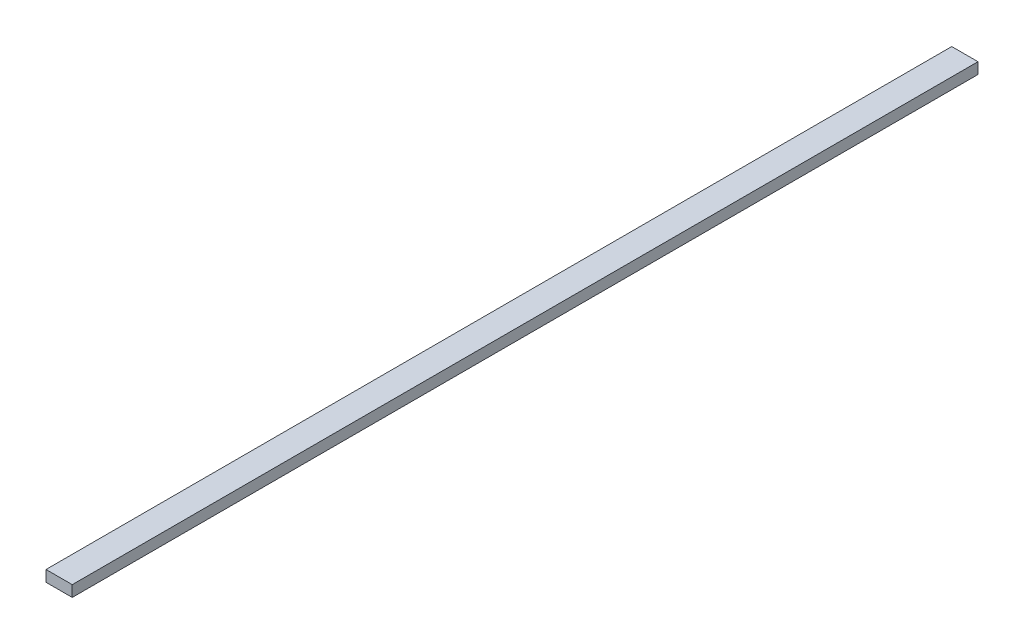
ISO-10303-21;
HEADER;
FILE_DESCRIPTION(('STEP AP214'),'2;1');
FILE_NAME('part.step','',(''),(''),'','','');
FILE_SCHEMA(('AUTOMOTIVE_DESIGN { 1 0 10303 214 1 1 1 1 }'));
ENDSEC;
DATA;
#1=APPLICATION_CONTEXT('core data for automotive mechanical design processes');
#2=APPLICATION_PROTOCOL_DEFINITION('international standard','automotive_design',2000,#1);
#3=PRODUCT_CONTEXT('',#1,'mechanical');
#4=PRODUCT('Part','Part','',(#3));
#5=PRODUCT_RELATED_PRODUCT_CATEGORY('part','',(#4));
#6=PRODUCT_DEFINITION_FORMATION('','',#4);
#7=PRODUCT_DEFINITION_CONTEXT('part definition',#1,'design');
#8=PRODUCT_DEFINITION('design','',#6,#7);
#9=PRODUCT_DEFINITION_SHAPE('','',#8);
#10=(LENGTH_UNIT() NAMED_UNIT(*) SI_UNIT(.MILLI.,.METRE.));
#11=(NAMED_UNIT(*) PLANE_ANGLE_UNIT() SI_UNIT($,.RADIAN.));
#12=(NAMED_UNIT(*) SI_UNIT($,.STERADIAN.) SOLID_ANGLE_UNIT());
#13=UNCERTAINTY_MEASURE_WITH_UNIT(LENGTH_MEASURE(1.E-05),#10,'distance_accuracy_value','');
#14=(GEOMETRIC_REPRESENTATION_CONTEXT(3) GLOBAL_UNCERTAINTY_ASSIGNED_CONTEXT((#13)) GLOBAL_UNIT_ASSIGNED_CONTEXT((#10,
#11,#12)) REPRESENTATION_CONTEXT('',''));
#15=CARTESIAN_POINT('',(0.,0.,0.));
#16=DIRECTION('',(0.,0.,1.));
#17=DIRECTION('',(1.,0.,0.));
#18=AXIS2_PLACEMENT_3D('',#15,#16,#17);
#19=CARTESIAN_POINT('',(-99.82498501329,20.83635158972,17.13381170755));
#20=DIRECTION('',(4.10509035317689E-06,0.999999999991574,0.));
#21=DIRECTION('',(-0.999999999991574,4.10509035317689E-06,0.));
#22=AXIS2_PLACEMENT_3D('',#19,#20,#21);
#23=PLANE('',#22);
#24=DIRECTION('',(0.999999999772767,-4.10509035227867E-06,2.09192424735977E-05));
#25=VECTOR('',#24,1.);
#26=CARTESIAN_POINT('',(-99.826405105929,20.8363515955496,-51.0144774151147));
#27=LINE('',#26,#25);
#28=CARTESIAN_POINT('',(-101.8,20.836359697335,-51.0145187012249));
#29=VERTEX_POINT('',#28);
#30=CARTESIAN_POINT('',(-97.8500000000018,20.8363434822281,-51.0144360702171));
#31=VERTEX_POINT('',#30);
#32=EDGE_CURVE('E20',#29,#31,#27,.T.);
#33=ORIENTED_EDGE('',*,*,#32,.F.);
#34=DIRECTION('',(0.,0.,-1.));
#35=VECTOR('',#34,1.);
#36=CARTESIAN_POINT('',(-101.8,20.836359697335,-68.8));
#37=LINE('',#36,#35);
#38=CARTESIAN_POINT('',(-101.8,20.836359697335,85.2818299895898));
#39=VERTEX_POINT('',#38);
#40=EDGE_CURVE('E74',#39,#29,#37,.T.);
#41=ORIENTED_EDGE('',*,*,#40,.F.);
#42=DIRECTION('',(-0.999999999761429,4.10509035223213E-06,-2.14543906354783E-05));
#43=VECTOR('',#42,1.);
#44=CARTESIAN_POINT('',(-99.8250385749859,20.8363515899399,85.2818723611837));
#45=LINE('',#44,#43);
#46=CARTESIAN_POINT('',(-97.8500000000523,20.8363434822281,85.2819147344328));
#47=VERTEX_POINT('',#46);
#48=EDGE_CURVE('E83',#47,#39,#45,.T.);
#49=ORIENTED_EDGE('',*,*,#48,.F.);
#50=DIRECTION('',(0.,0.,1.));
#51=VECTOR('',#50,1.);
#52=CARTESIAN_POINT('',(-97.8500000000037,20.8363434822281,17.13381170755));
#53=LINE('',#52,#51);
#54=EDGE_CURVE('E87',#47,#31,#53,.F.);
#55=ORIENTED_EDGE('',*,*,#54,.T.);
#56=EDGE_LOOP('',(#33,#41,#49,#55));
#57=FACE_BOUND('',#56,.T.);
#58=ADVANCED_FACE('F17',(#57),#23,.T.);
#59=CARTESIAN_POINT('',(-99.82640853925,19.99999353882,-51.01447762271));
#60=DIRECTION('',(2.09192434923592E-05,2.48127517059491E-07,-0.999999999781162));
#61=DIRECTION('',(-0.999999999781193,0.,-2.09192434923598E-05));
#62=AXIS2_PLACEMENT_3D('',#59,#60,#61);
#63=PLANE('',#62);
#64=DIRECTION('',(0.999999999772456,4.18010133512021E-06,2.09192445293752E-05));
#65=VECTOR('',#64,1.);
#66=CARTESIAN_POINT('',(-99.8235594629891,19.1636373785792,-51.0144777706324));
#67=LINE('',#66,#65);
#68=CARTESIAN_POINT('',(-101.8,19.1636291168575,-51.0145191162753));
#69=VERTEX_POINT('',#68);
#70=CARTESIAN_POINT('',(-97.85,19.1636456282577,-51.0144364852594));
#71=VERTEX_POINT('',#70);
#72=EDGE_CURVE('E59',#69,#71,#67,.T.);
#73=ORIENTED_EDGE('',*,*,#72,.F.);
#74=DIRECTION('',(0.,-0.999999999999969,-2.48127517113783E-07));
#75=VECTOR('',#74,1.);
#76=CARTESIAN_POINT('',(-101.8,-54.0000044130627,-51.0145372701861));
#77=LINE('',#76,#75);
#78=EDGE_CURVE('E62',#29,#69,#77,.T.);
#79=ORIENTED_EDGE('',*,*,#78,.F.);
#80=ORIENTED_EDGE('',*,*,#32,.T.);
#81=DIRECTION('',(0.,-0.999999999999969,-2.48127517113783E-07));
#82=VECTOR('',#81,1.);
#83=CARTESIAN_POINT('',(-97.85,-54.0000044130832,-51.0144546391743));
#84=LINE('',#83,#82);
#85=EDGE_CURVE('E65',#31,#71,#84,.T.);
#86=ORIENTED_EDGE('',*,*,#85,.T.);
#87=EDGE_LOOP('',(#73,#79,#80,#86));
#88=FACE_BOUND('',#87,.T.);
#89=ADVANCED_FACE('F61',(#88),#63,.T.);
#90=CARTESIAN_POINT('',(-97.85,-54.,-68.8));
#91=DIRECTION('',(-1.,0.,0.));
#92=DIRECTION('',(0.,0.,1.));
#93=AXIS2_PLACEMENT_3D('',#90,#91,#92);
#94=PLANE('',#93);
#95=DIRECTION('',(0.,1.,0.));
#96=VECTOR('',#95,1.);
#97=CARTESIAN_POINT('',(-97.850000000101,19.99999627835,85.2819147344328));
#98=LINE('',#97,#96);
#99=CARTESIAN_POINT('',(-97.8500000000505,19.1636456282577,85.2819147344328));
#100=VERTEX_POINT('',#99);
#101=EDGE_CURVE('E85',#100,#47,#98,.T.);
#102=ORIENTED_EDGE('',*,*,#101,.F.);
#103=DIRECTION('',(0.,0.,1.));
#104=VECTOR('',#103,1.);
#105=CARTESIAN_POINT('',(-97.85,19.1636456282577,-68.8));
#106=LINE('',#105,#104);
#107=EDGE_CURVE('E69',#71,#100,#106,.T.);
#108=ORIENTED_EDGE('',*,*,#107,.F.);
#109=ORIENTED_EDGE('',*,*,#85,.F.);
#110=ORIENTED_EDGE('',*,*,#54,.F.);
#111=EDGE_LOOP('',(#102,#108,#109,#110));
#112=FACE_BOUND('',#111,.T.);
#113=ADVANCED_FACE('F90',(#112),#94,.F.);
#114=CARTESIAN_POINT('',(-99.8250420083,19.99999627835,85.28187236111));
#115=DIRECTION('',(-2.1454390635659E-05,0.,0.999999999769855));
#116=DIRECTION('',(0.999999999769855,0.,2.1454390635659E-05));
#117=AXIS2_PLACEMENT_3D('',#114,#115,#116);
#118=PLANE('',#117);
#119=ORIENTED_EDGE('',*,*,#48,.T.);
#120=DIRECTION('',(0.,1.,0.));
#121=VECTOR('',#120,1.);
#122=CARTESIAN_POINT('',(-101.8,-54.,85.2818299895898));
#123=LINE('',#122,#121);
#124=CARTESIAN_POINT('',(-101.799999999583,19.1636291168575,85.2818299895898));
#125=VERTEX_POINT('',#124);
#126=EDGE_CURVE('E35',#125,#39,#123,.T.);
#127=ORIENTED_EDGE('',*,*,#126,.F.);
#128=DIRECTION('',(-0.999999999761118,-4.18010133507282E-06,-2.14543906354716E-05));
#129=VECTOR('',#128,1.);
#130=CARTESIAN_POINT('',(-99.8264471488161,19.1636373665084,85.2818723309636));
#131=LINE('',#130,#129);
#132=EDGE_CURVE('E26',#100,#125,#131,.T.);
#133=ORIENTED_EDGE('',*,*,#132,.F.);
#134=ORIENTED_EDGE('',*,*,#101,.T.);
#135=EDGE_LOOP('',(#119,#127,#133,#134));
#136=FACE_BOUND('',#135,.T.);
#137=ADVANCED_FACE('F91',(#136),#118,.T.);
#138=CARTESIAN_POINT('',(-101.8,-54.,-68.8));
#139=DIRECTION('',(-1.,0.,0.));
#140=DIRECTION('',(0.,0.,1.));
#141=AXIS2_PLACEMENT_3D('',#138,#139,#140);
#142=PLANE('',#141);
#143=ORIENTED_EDGE('',*,*,#40,.T.);
#144=ORIENTED_EDGE('',*,*,#78,.T.);
#145=DIRECTION('',(0.,0.,1.));
#146=VECTOR('',#145,1.);
#147=CARTESIAN_POINT('',(-101.799999999165,19.1636291168575,17.13384750124));
#148=LINE('',#147,#146);
#149=EDGE_CURVE('E11',#125,#69,#148,.F.);
#150=ORIENTED_EDGE('',*,*,#149,.F.);
#151=ORIENTED_EDGE('',*,*,#126,.T.);
#152=EDGE_LOOP('',(#143,#144,#150,#151));
#153=FACE_BOUND('',#152,.T.);
#154=ADVANCED_FACE('F72',(#153),#142,.T.);
#155=CARTESIAN_POINT('',(-99.82498507447,19.16363737262,17.13384750124));
#156=DIRECTION('',(4.18010133603485E-06,-0.999999999991264,0.));
#157=DIRECTION('',(0.999999999991263,4.18010133603485E-06,0.));
#158=AXIS2_PLACEMENT_3D('',#155,#156,#157);
#159=PLANE('',#158);
#160=ORIENTED_EDGE('',*,*,#132,.T.);
#161=ORIENTED_EDGE('',*,*,#149,.T.);
#162=ORIENTED_EDGE('',*,*,#72,.T.);
#163=ORIENTED_EDGE('',*,*,#107,.T.);
#164=EDGE_LOOP('',(#160,#161,#162,#163));
#165=FACE_BOUND('',#164,.T.);
#166=ADVANCED_FACE('F76',(#165),#159,.T.);
#167=CLOSED_SHELL('',(#58,#89,#113,#137,#154,#166));
#168=MANIFOLD_SOLID_BREP('B1',#167);
#169=ADVANCED_BREP_SHAPE_REPRESENTATION('',(#18,#168),#14);
#170=SHAPE_DEFINITION_REPRESENTATION(#9,#169);
ENDSEC;
END-ISO-10303-21;
